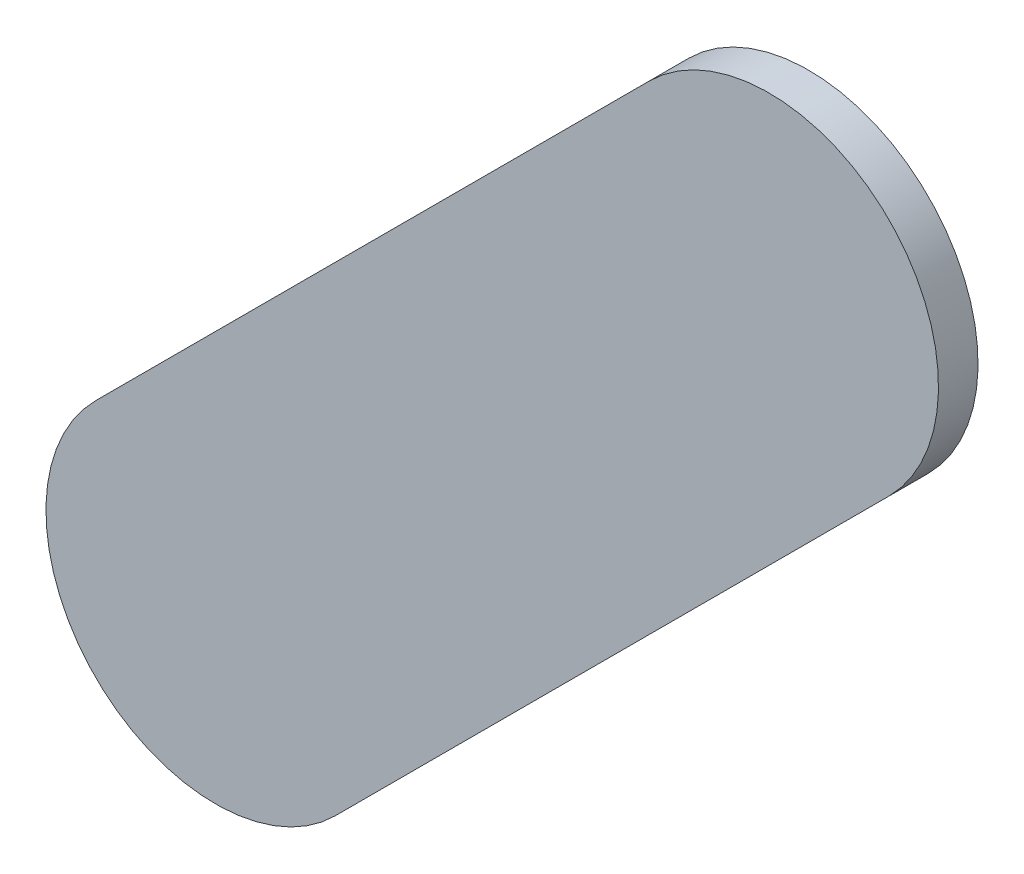
ISO-10303-21;
HEADER;
FILE_DESCRIPTION(('STEP AP214'),'2;1');
FILE_NAME('part.step','',(''),(''),'','','');
FILE_SCHEMA(('AUTOMOTIVE_DESIGN { 1 0 10303 214 1 1 1 1 }'));
ENDSEC;
DATA;
#1=APPLICATION_CONTEXT('core data for automotive mechanical design processes');
#2=APPLICATION_PROTOCOL_DEFINITION('international standard','automotive_design',2000,#1);
#3=PRODUCT_CONTEXT('',#1,'mechanical');
#4=PRODUCT('Part','Part','',(#3));
#5=PRODUCT_RELATED_PRODUCT_CATEGORY('part','',(#4));
#6=PRODUCT_DEFINITION_FORMATION('','',#4);
#7=PRODUCT_DEFINITION_CONTEXT('part definition',#1,'design');
#8=PRODUCT_DEFINITION('design','',#6,#7);
#9=PRODUCT_DEFINITION_SHAPE('','',#8);
#10=(LENGTH_UNIT() NAMED_UNIT(*) SI_UNIT(.MILLI.,.METRE.));
#11=(NAMED_UNIT(*) PLANE_ANGLE_UNIT() SI_UNIT($,.RADIAN.));
#12=(NAMED_UNIT(*) SI_UNIT($,.STERADIAN.) SOLID_ANGLE_UNIT());
#13=UNCERTAINTY_MEASURE_WITH_UNIT(LENGTH_MEASURE(1.E-05),#10,'distance_accuracy_value','');
#14=(GEOMETRIC_REPRESENTATION_CONTEXT(3) GLOBAL_UNCERTAINTY_ASSIGNED_CONTEXT((#13)) GLOBAL_UNIT_ASSIGNED_CONTEXT((#10,
#11,#12)) REPRESENTATION_CONTEXT('',''));
#15=CARTESIAN_POINT('',(0.,0.,0.));
#16=DIRECTION('',(0.,0.,1.));
#17=DIRECTION('',(1.,0.,0.));
#18=AXIS2_PLACEMENT_3D('',#15,#16,#17);
#19=CARTESIAN_POINT('',(126.893933,-71.623933,1.635));
#20=DIRECTION('',(0.,0.,1.));
#21=DIRECTION('',(1.,0.,0.));
#22=AXIS2_PLACEMENT_3D('',#19,#20,#21);
#23=PLANE('',#22);
#24=DIRECTION('',(-0.707106781186548,-0.707106781186548,0.));
#25=VECTOR('',#24,1.);
#26=CARTESIAN_POINT('',(126.893933,-71.623933,1.635));
#27=LINE('',#26,#25);
#28=CARTESIAN_POINT('',(126.893933,-71.623933,1.635));
#29=VERTEX_POINT('',#28);
#30=CARTESIAN_POINT('',(126.403933,-72.113933,1.635));
#31=VERTEX_POINT('',#30);
#32=EDGE_CURVE('E82',#29,#31,#27,.T.);
#33=ORIENTED_EDGE('',*,*,#32,.T.);
#34=CARTESIAN_POINT('',(126.5099995,-72.2199995,1.635));
#35=DIRECTION('',(0.,0.,1.));
#36=DIRECTION('',(-0.707106781186548,0.707106781186548,0.));
#37=AXIS2_PLACEMENT_3D('',#34,#35,#36);
#38=CIRCLE('',#37,0.150000682813);
#39=CARTESIAN_POINT('',(126.616066,-72.326066,1.635));
#40=VERTEX_POINT('',#39);
#41=EDGE_CURVE('E108',#31,#40,#38,.T.);
#42=ORIENTED_EDGE('',*,*,#41,.T.);
#43=DIRECTION('',(0.707106781186548,0.707106781186548,0.));
#44=VECTOR('',#43,1.);
#45=CARTESIAN_POINT('',(126.616066,-72.326066,1.635));
#46=LINE('',#45,#44);
#47=CARTESIAN_POINT('',(127.106066,-71.836066,1.635));
#48=VERTEX_POINT('',#47);
#49=EDGE_CURVE('E75',#40,#48,#46,.T.);
#50=ORIENTED_EDGE('',*,*,#49,.T.);
#51=CARTESIAN_POINT('',(126.9999995,-71.7299995,1.635));
#52=DIRECTION('',(0.,0.,1.));
#53=DIRECTION('',(0.707106781186548,-0.707106781186548,0.));
#54=AXIS2_PLACEMENT_3D('',#51,#52,#53);
#55=CIRCLE('',#54,0.150000682813);
#56=EDGE_CURVE('E11',#48,#29,#55,.T.);
#57=ORIENTED_EDGE('',*,*,#56,.T.);
#58=EDGE_LOOP('',(#33,#42,#50,#57));
#59=FACE_BOUND('',#58,.T.);
#60=ADVANCED_FACE('F17',(#59),#23,.T.);
#61=CARTESIAN_POINT('',(126.893933,-71.623933,1.6));
#62=DIRECTION('',(0.,0.,1.));
#63=DIRECTION('',(1.,0.,0.));
#64=AXIS2_PLACEMENT_3D('',#61,#62,#63);
#65=PLANE('',#64);
#66=CARTESIAN_POINT('',(126.9999995,-71.7299995,1.6));
#67=DIRECTION('',(0.,0.,1.));
#68=DIRECTION('',(0.707106781186548,-0.707106781186548,0.));
#69=AXIS2_PLACEMENT_3D('',#66,#67,#68);
#70=CIRCLE('',#69,0.150000682813);
#71=CARTESIAN_POINT('',(127.106066,-71.836066,1.6));
#72=VERTEX_POINT('',#71);
#73=CARTESIAN_POINT('',(126.893933,-71.623933,1.6));
#74=VERTEX_POINT('',#73);
#75=EDGE_CURVE('E20',#72,#74,#70,.T.);
#76=ORIENTED_EDGE('',*,*,#75,.F.);
#77=DIRECTION('',(0.707106781186548,0.707106781186548,0.));
#78=VECTOR('',#77,1.);
#79=CARTESIAN_POINT('',(126.616066,-72.326066,1.6));
#80=LINE('',#79,#78);
#81=CARTESIAN_POINT('',(126.616066,-72.326066,1.6));
#82=VERTEX_POINT('',#81);
#83=EDGE_CURVE('E101',#82,#72,#80,.T.);
#84=ORIENTED_EDGE('',*,*,#83,.F.);
#85=CARTESIAN_POINT('',(126.5099995,-72.2199995,1.6));
#86=DIRECTION('',(0.,0.,1.));
#87=DIRECTION('',(-0.707106781186548,0.707106781186548,0.));
#88=AXIS2_PLACEMENT_3D('',#85,#86,#87);
#89=CIRCLE('',#88,0.150000682813);
#90=CARTESIAN_POINT('',(126.403933,-72.113933,1.6));
#91=VERTEX_POINT('',#90);
#92=EDGE_CURVE('E84',#91,#82,#89,.T.);
#93=ORIENTED_EDGE('',*,*,#92,.F.);
#94=DIRECTION('',(-0.707106781186548,-0.707106781186548,0.));
#95=VECTOR('',#94,1.);
#96=CARTESIAN_POINT('',(126.893933,-71.623933,1.6));
#97=LINE('',#96,#95);
#98=EDGE_CURVE('E80',#74,#91,#97,.T.);
#99=ORIENTED_EDGE('',*,*,#98,.F.);
#100=EDGE_LOOP('',(#76,#84,#93,#99));
#101=FACE_BOUND('',#100,.T.);
#102=ADVANCED_FACE('F86',(#101),#65,.F.);
#103=CARTESIAN_POINT('',(126.9999995,-71.7299995,1.6));
#104=DIRECTION('',(0.,0.,-1.));
#105=DIRECTION('',(0.707106781186548,-0.707106781186548,0.));
#106=AXIS2_PLACEMENT_3D('',#103,#104,#105);
#107=CYLINDRICAL_SURFACE('',#106,0.150000682813);
#108=ORIENTED_EDGE('',*,*,#75,.T.);
#109=DIRECTION('',(0.,0.,1.));
#110=VECTOR('',#109,1.);
#111=CARTESIAN_POINT('',(126.893933,-71.623933,1.6));
#112=LINE('',#111,#110);
#113=EDGE_CURVE('E69',#74,#29,#112,.T.);
#114=ORIENTED_EDGE('',*,*,#113,.T.);
#115=ORIENTED_EDGE('',*,*,#56,.F.);
#116=DIRECTION('',(0.,0.,1.));
#117=VECTOR('',#116,1.);
#118=CARTESIAN_POINT('',(127.106066,-71.836066,1.6));
#119=LINE('',#118,#117);
#120=EDGE_CURVE('E72',#72,#48,#119,.T.);
#121=ORIENTED_EDGE('',*,*,#120,.F.);
#122=EDGE_LOOP('',(#108,#114,#115,#121));
#123=FACE_BOUND('',#122,.T.);
#124=ADVANCED_FACE('F68',(#123),#107,.T.);
#125=CARTESIAN_POINT('',(126.616066,-72.326066,1.6));
#126=DIRECTION('',(-0.707106781186548,0.707106781186548,0.));
#127=DIRECTION('',(0.,0.,1.));
#128=AXIS2_PLACEMENT_3D('',#125,#126,#127);
#129=PLANE('',#128);
#130=ORIENTED_EDGE('',*,*,#83,.T.);
#131=ORIENTED_EDGE('',*,*,#120,.T.);
#132=ORIENTED_EDGE('',*,*,#49,.F.);
#133=DIRECTION('',(0.,0.,1.));
#134=VECTOR('',#133,1.);
#135=CARTESIAN_POINT('',(126.616066,-72.326066,1.6));
#136=LINE('',#135,#134);
#137=EDGE_CURVE('E104',#82,#40,#136,.T.);
#138=ORIENTED_EDGE('',*,*,#137,.F.);
#139=EDGE_LOOP('',(#130,#131,#132,#138));
#140=FACE_BOUND('',#139,.T.);
#141=ADVANCED_FACE('F119',(#140),#129,.F.);
#142=CARTESIAN_POINT('',(126.5099995,-72.2199995,1.6));
#143=DIRECTION('',(0.,0.,-1.));
#144=DIRECTION('',(-0.707106781186548,0.707106781186548,0.));
#145=AXIS2_PLACEMENT_3D('',#142,#143,#144);
#146=CYLINDRICAL_SURFACE('',#145,0.150000682813);
#147=ORIENTED_EDGE('',*,*,#92,.T.);
#148=ORIENTED_EDGE('',*,*,#137,.T.);
#149=ORIENTED_EDGE('',*,*,#41,.F.);
#150=DIRECTION('',(0.,0.,1.));
#151=VECTOR('',#150,1.);
#152=CARTESIAN_POINT('',(126.403933,-72.113933,1.6));
#153=LINE('',#152,#151);
#154=EDGE_CURVE('E90',#91,#31,#153,.T.);
#155=ORIENTED_EDGE('',*,*,#154,.F.);
#156=EDGE_LOOP('',(#147,#148,#149,#155));
#157=FACE_BOUND('',#156,.T.);
#158=ADVANCED_FACE('F121',(#157),#146,.T.);
#159=CARTESIAN_POINT('',(126.893933,-71.623933,1.6));
#160=DIRECTION('',(0.707106781186548,-0.707106781186548,0.));
#161=DIRECTION('',(0.,0.,-1.));
#162=AXIS2_PLACEMENT_3D('',#159,#160,#161);
#163=PLANE('',#162);
#164=ORIENTED_EDGE('',*,*,#98,.T.);
#165=ORIENTED_EDGE('',*,*,#154,.T.);
#166=ORIENTED_EDGE('',*,*,#32,.F.);
#167=ORIENTED_EDGE('',*,*,#113,.F.);
#168=EDGE_LOOP('',(#164,#165,#166,#167));
#169=FACE_BOUND('',#168,.T.);
#170=ADVANCED_FACE('F78',(#169),#163,.F.);
#171=CLOSED_SHELL('',(#60,#102,#124,#141,#158,#170));
#172=MANIFOLD_SOLID_BREP('B1',#171);
#173=ADVANCED_BREP_SHAPE_REPRESENTATION('',(#18,#172),#14);
#174=SHAPE_DEFINITION_REPRESENTATION(#9,#173);
ENDSEC;
END-ISO-10303-21;
